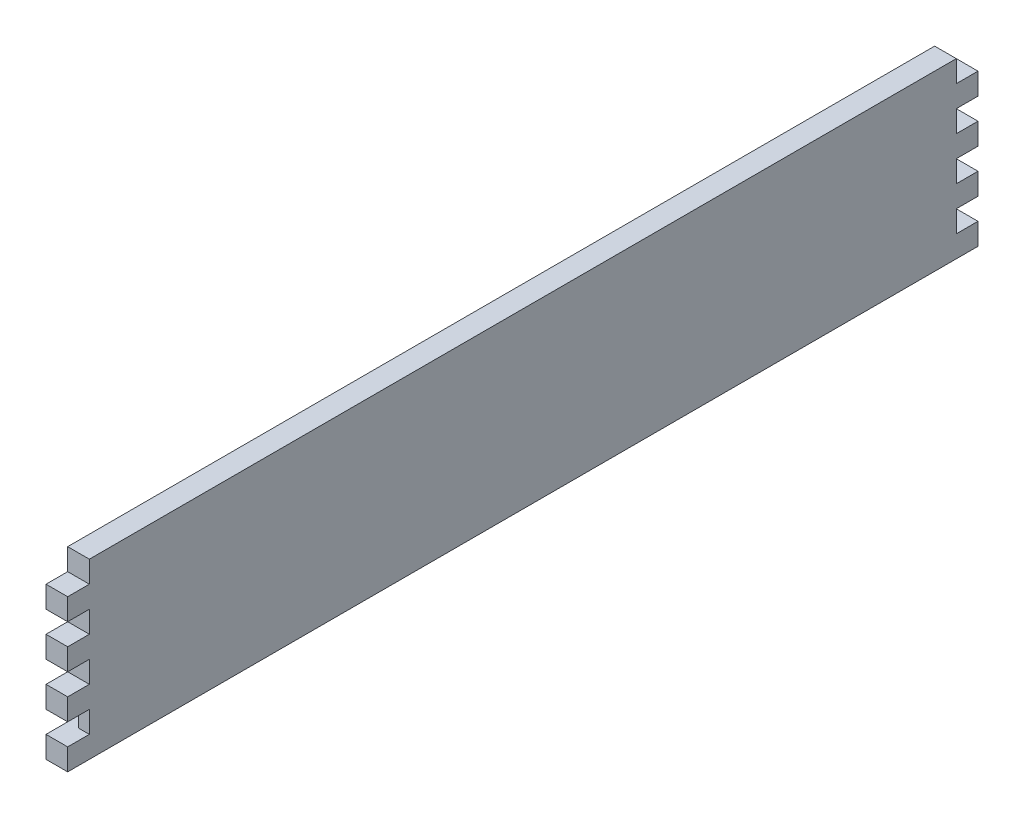
ISO-10303-21;
HEADER;
FILE_DESCRIPTION(('STEP AP214'),'2;1');
FILE_NAME('part.step','',(''),(''),'','','');
FILE_SCHEMA(('AUTOMOTIVE_DESIGN { 1 0 10303 214 1 1 1 1 }'));
ENDSEC;
DATA;
#1=APPLICATION_CONTEXT('core data for automotive mechanical design processes');
#2=APPLICATION_PROTOCOL_DEFINITION('international standard','automotive_design',2000,#1);
#3=PRODUCT_CONTEXT('',#1,'mechanical');
#4=PRODUCT('Part','Part','',(#3));
#5=PRODUCT_RELATED_PRODUCT_CATEGORY('part','',(#4));
#6=PRODUCT_DEFINITION_FORMATION('','',#4);
#7=PRODUCT_DEFINITION_CONTEXT('part definition',#1,'design');
#8=PRODUCT_DEFINITION('design','',#6,#7);
#9=PRODUCT_DEFINITION_SHAPE('','',#8);
#10=(LENGTH_UNIT() NAMED_UNIT(*) SI_UNIT(.MILLI.,.METRE.));
#11=(NAMED_UNIT(*) PLANE_ANGLE_UNIT() SI_UNIT($,.RADIAN.));
#12=(NAMED_UNIT(*) SI_UNIT($,.STERADIAN.) SOLID_ANGLE_UNIT());
#13=UNCERTAINTY_MEASURE_WITH_UNIT(LENGTH_MEASURE(1.E-05),#10,'distance_accuracy_value','');
#14=(GEOMETRIC_REPRESENTATION_CONTEXT(3) GLOBAL_UNCERTAINTY_ASSIGNED_CONTEXT((#13)) GLOBAL_UNIT_ASSIGNED_CONTEXT((#10,
#11,#12)) REPRESENTATION_CONTEXT('',''));
#15=CARTESIAN_POINT('',(0.,0.,0.));
#16=DIRECTION('',(0.,0.,1.));
#17=DIRECTION('',(1.,0.,0.));
#18=AXIS2_PLACEMENT_3D('',#15,#16,#17);
#19=CARTESIAN_POINT('',(12.7,1.33573707650224E-13,-12.7000000000009));
#20=DIRECTION('',(0.,0.,-1.));
#21=DIRECTION('',(0.,1.,0.));
#22=AXIS2_PLACEMENT_3D('',#19,#20,#21);
#23=PLANE('',#22);
#24=DIRECTION('',(-1.,0.,0.));
#25=VECTOR('',#24,1.);
#26=CARTESIAN_POINT('',(12.7,19.0499999999999,-12.7000000000007));
#27=LINE('',#26,#25);
#28=CARTESIAN_POINT('',(6.35,19.0499999999999,-12.7000000000007));
#29=VERTEX_POINT('',#28);
#30=CARTESIAN_POINT('',(0.,19.0499999999999,-12.7000000000007));
#31=VERTEX_POINT('',#30);
#32=EDGE_CURVE('E439',#29,#31,#27,.T.);
#33=ORIENTED_EDGE('',*,*,#32,.F.);
#34=DIRECTION('',(0.,1.,0.));
#35=VECTOR('',#34,1.);
#36=CARTESIAN_POINT('',(6.35,1.33573707650224E-13,-12.7000000000009));
#37=LINE('',#36,#35);
#38=CARTESIAN_POINT('',(6.35,12.6999999999999,-12.7000000000008));
#39=VERTEX_POINT('',#38);
#40=EDGE_CURVE('E279',#39,#29,#37,.T.);
#41=ORIENTED_EDGE('',*,*,#40,.F.);
#42=DIRECTION('',(-1.,0.,0.));
#43=VECTOR('',#42,1.);
#44=CARTESIAN_POINT('',(12.7,12.7,-12.7000000000008));
#45=LINE('',#44,#43);
#46=CARTESIAN_POINT('',(12.7,12.7,-12.7000000000008));
#47=VERTEX_POINT('',#46);
#48=EDGE_CURVE('E368',#47,#39,#45,.T.);
#49=ORIENTED_EDGE('',*,*,#48,.F.);
#50=DIRECTION('',(0.,-1.,0.));
#51=VECTOR('',#50,1.);
#52=CARTESIAN_POINT('',(12.7,1.33573707650224E-13,-12.7000000000009));
#53=LINE('',#52,#51);
#54=CARTESIAN_POINT('',(12.7,25.4,-12.7000000000007));
#55=VERTEX_POINT('',#54);
#56=EDGE_CURVE('E520',#55,#47,#53,.T.);
#57=ORIENTED_EDGE('',*,*,#56,.F.);
#58=DIRECTION('',(-1.,0.,0.));
#59=VECTOR('',#58,1.);
#60=CARTESIAN_POINT('',(12.7,25.4,-12.7000000000007));
#61=LINE('',#60,#59);
#62=CARTESIAN_POINT('',(0.,25.4,-12.7000000000007));
#63=VERTEX_POINT('',#62);
#64=EDGE_CURVE('E371',#55,#63,#61,.T.);
#65=ORIENTED_EDGE('',*,*,#64,.T.);
#66=DIRECTION('',(0.,-1.,0.));
#67=VECTOR('',#66,1.);
#68=CARTESIAN_POINT('',(0.,1.33573707650224E-13,-12.7000000000009));
#69=LINE('',#68,#67);
#70=EDGE_CURVE('E346',#63,#31,#69,.T.);
#71=ORIENTED_EDGE('',*,*,#70,.T.);
#72=EDGE_LOOP('',(#33,#41,#49,#57,#65,#71));
#73=FACE_BOUND('',#72,.T.);
#74=ADVANCED_FACE('F33',(#73),#23,.F.);
#75=CARTESIAN_POINT('',(12.7,4.55191440096315E-12,-520.700000000001));
#76=DIRECTION('',(0.,0.,-1.));
#77=DIRECTION('',(0.,1.,0.));
#78=AXIS2_PLACEMENT_3D('',#75,#76,#77);
#79=PLANE('',#78);
#80=DIRECTION('',(0.,1.,0.));
#81=VECTOR('',#80,1.);
#82=CARTESIAN_POINT('',(6.35,4.55191440096315E-12,-520.700000000001));
#83=LINE('',#82,#81);
#84=CARTESIAN_POINT('',(6.35,12.7,-520.700000000001));
#85=VERTEX_POINT('',#84);
#86=CARTESIAN_POINT('',(6.35,19.05,-520.700000000001));
#87=VERTEX_POINT('',#86);
#88=EDGE_CURVE('E11',#85,#87,#83,.T.);
#89=ORIENTED_EDGE('',*,*,#88,.T.);
#90=DIRECTION('',(-1.,0.,0.));
#91=VECTOR('',#90,1.);
#92=CARTESIAN_POINT('',(12.7,19.05,-520.700000000001));
#93=LINE('',#92,#91);
#94=CARTESIAN_POINT('',(0.,19.05,-520.700000000001));
#95=VERTEX_POINT('',#94);
#96=EDGE_CURVE('E435',#87,#95,#93,.T.);
#97=ORIENTED_EDGE('',*,*,#96,.T.);
#98=DIRECTION('',(0.,-1.,0.));
#99=VECTOR('',#98,1.);
#100=CARTESIAN_POINT('',(0.,4.55191440096315E-12,-520.700000000001));
#101=LINE('',#100,#99);
#102=CARTESIAN_POINT('',(0.,25.4,-520.700000000001));
#103=VERTEX_POINT('',#102);
#104=EDGE_CURVE('E357',#103,#95,#101,.T.);
#105=ORIENTED_EDGE('',*,*,#104,.F.);
#106=DIRECTION('',(-1.,0.,0.));
#107=VECTOR('',#106,1.);
#108=CARTESIAN_POINT('',(12.7,25.4,-520.700000000001));
#109=LINE('',#108,#107);
#110=CARTESIAN_POINT('',(12.7,25.4,-520.700000000001));
#111=VERTEX_POINT('',#110);
#112=EDGE_CURVE('E50',#111,#103,#109,.T.);
#113=ORIENTED_EDGE('',*,*,#112,.F.);
#114=DIRECTION('',(0.,-1.,0.));
#115=VECTOR('',#114,1.);
#116=CARTESIAN_POINT('',(12.7,4.55191440096315E-12,-520.700000000001));
#117=LINE('',#116,#115);
#118=CARTESIAN_POINT('',(12.7,12.7,-520.700000000001));
#119=VERTEX_POINT('',#118);
#120=EDGE_CURVE('E271',#111,#119,#117,.T.);
#121=ORIENTED_EDGE('',*,*,#120,.T.);
#122=DIRECTION('',(-1.,0.,0.));
#123=VECTOR('',#122,1.);
#124=CARTESIAN_POINT('',(12.7,12.7,-520.700000000001));
#125=LINE('',#124,#123);
#126=EDGE_CURVE('E266',#119,#85,#125,.T.);
#127=ORIENTED_EDGE('',*,*,#126,.T.);
#128=EDGE_LOOP('',(#89,#97,#105,#113,#121,#127));
#129=FACE_BOUND('',#128,.T.);
#130=ADVANCED_FACE('F444',(#129),#79,.T.);
#131=CARTESIAN_POINT('',(0.,0.,0.));
#132=DIRECTION('',(1.,0.,0.));
#133=DIRECTION('',(0.,0.,-1.));
#134=AXIS2_PLACEMENT_3D('',#131,#132,#133);
#135=PLANE('',#134);
#136=DIRECTION('',(0.,0.,-1.));
#137=VECTOR('',#136,1.);
#138=CARTESIAN_POINT('',(0.,19.0499999999999,0.));
#139=LINE('',#138,#137);
#140=EDGE_CURVE('E42',#31,#95,#139,.T.);
#141=ORIENTED_EDGE('',*,*,#140,.F.);
#142=ORIENTED_EDGE('',*,*,#70,.F.);
#143=DIRECTION('',(0.,0.,1.));
#144=VECTOR('',#143,1.);
#145=CARTESIAN_POINT('',(0.,25.4,0.));
#146=LINE('',#145,#144);
#147=CARTESIAN_POINT('',(0.,25.4,-6.65127195526621E-13));
#148=VERTEX_POINT('',#147);
#149=EDGE_CURVE('E343',#63,#148,#146,.T.);
#150=ORIENTED_EDGE('',*,*,#149,.T.);
#151=DIRECTION('',(0.,1.,0.));
#152=VECTOR('',#151,1.);
#153=CARTESIAN_POINT('',(0.,0.,-9.31178073069464E-13));
#154=LINE('',#153,#152);
#155=CARTESIAN_POINT('',(0.,38.1,-5.32101756421297E-13));
#156=VERTEX_POINT('',#155);
#157=EDGE_CURVE('E340',#148,#156,#154,.T.);
#158=ORIENTED_EDGE('',*,*,#157,.T.);
#159=DIRECTION('',(0.,0.,1.));
#160=VECTOR('',#159,1.);
#161=CARTESIAN_POINT('',(0.,38.1,0.));
#162=LINE('',#161,#160);
#163=CARTESIAN_POINT('',(0.,38.1,-12.7000000000005));
#164=VERTEX_POINT('',#163);
#165=EDGE_CURVE('E337',#164,#156,#162,.T.);
#166=ORIENTED_EDGE('',*,*,#165,.F.);
#167=DIRECTION('',(0.,-1.,0.));
#168=VECTOR('',#167,1.);
#169=CARTESIAN_POINT('',(0.,1.33573707650224E-13,-12.7000000000009));
#170=LINE('',#169,#168);
#171=CARTESIAN_POINT('',(0.,50.8,-12.7000000000004));
#172=VERTEX_POINT('',#171);
#173=EDGE_CURVE('E335',#172,#164,#170,.T.);
#174=ORIENTED_EDGE('',*,*,#173,.F.);
#175=DIRECTION('',(0.,0.,1.));
#176=VECTOR('',#175,1.);
#177=CARTESIAN_POINT('',(0.,50.8,0.));
#178=LINE('',#177,#176);
#179=CARTESIAN_POINT('',(0.,50.8,-3.99076317315973E-13));
#180=VERTEX_POINT('',#179);
#181=EDGE_CURVE('E332',#172,#180,#178,.T.);
#182=ORIENTED_EDGE('',*,*,#181,.T.);
#183=DIRECTION('',(0.,1.,0.));
#184=VECTOR('',#183,1.);
#185=CARTESIAN_POINT('',(0.,0.,-9.31178073069463E-13));
#186=LINE('',#185,#184);
#187=CARTESIAN_POINT('',(0.,63.5,-2.66050878210648E-13));
#188=VERTEX_POINT('',#187);
#189=EDGE_CURVE('E329',#180,#188,#186,.T.);
#190=ORIENTED_EDGE('',*,*,#189,.T.);
#191=DIRECTION('',(0.,0.,1.));
#192=VECTOR('',#191,1.);
#193=CARTESIAN_POINT('',(0.,63.5,0.));
#194=LINE('',#193,#192);
#195=CARTESIAN_POINT('',(0.,63.5,-12.7000000000003));
#196=VERTEX_POINT('',#195);
#197=EDGE_CURVE('E326',#196,#188,#194,.T.);
#198=ORIENTED_EDGE('',*,*,#197,.F.);
#199=DIRECTION('',(0.,-1.,0.));
#200=VECTOR('',#199,1.);
#201=CARTESIAN_POINT('',(0.,1.31838984174247E-13,-12.7000000000009));
#202=LINE('',#201,#200);
#203=CARTESIAN_POINT('',(0.,76.2,-12.7000000000001));
#204=VERTEX_POINT('',#203);
#205=EDGE_CURVE('E324',#204,#196,#202,.T.);
#206=ORIENTED_EDGE('',*,*,#205,.F.);
#207=DIRECTION('',(0.,0.,1.));
#208=VECTOR('',#207,1.);
#209=CARTESIAN_POINT('',(0.,76.2,0.));
#210=LINE('',#209,#208);
#211=CARTESIAN_POINT('',(0.,76.2,-1.33025439105324E-13));
#212=VERTEX_POINT('',#211);
#213=EDGE_CURVE('E321',#204,#212,#210,.T.);
#214=ORIENTED_EDGE('',*,*,#213,.T.);
#215=DIRECTION('',(0.,1.,0.));
#216=VECTOR('',#215,1.);
#217=CARTESIAN_POINT('',(0.,0.,-9.31178073069463E-13));
#218=LINE('',#217,#216);
#219=CARTESIAN_POINT('',(0.,88.9,0.));
#220=VERTEX_POINT('',#219);
#221=EDGE_CURVE('E318',#212,#220,#218,.T.);
#222=ORIENTED_EDGE('',*,*,#221,.T.);
#223=DIRECTION('',(0.,0.,1.));
#224=VECTOR('',#223,1.);
#225=CARTESIAN_POINT('',(0.,88.9,0.));
#226=LINE('',#225,#224);
#227=CARTESIAN_POINT('',(0.,88.9,-12.7));
#228=VERTEX_POINT('',#227);
#229=EDGE_CURVE('E315',#228,#220,#226,.T.);
#230=ORIENTED_EDGE('',*,*,#229,.F.);
#231=DIRECTION('',(0.,-1.,0.));
#232=VECTOR('',#231,1.);
#233=CARTESIAN_POINT('',(0.,0.,-12.7));
#234=LINE('',#233,#232);
#235=CARTESIAN_POINT('',(0.,101.6,-12.7));
#236=VERTEX_POINT('',#235);
#237=EDGE_CURVE('E313',#236,#228,#234,.T.);
#238=ORIENTED_EDGE('',*,*,#237,.F.);
#239=DIRECTION('',(0.,0.,-1.));
#240=VECTOR('',#239,1.);
#241=CARTESIAN_POINT('',(0.,101.6,0.));
#242=LINE('',#241,#240);
#243=CARTESIAN_POINT('',(0.,101.6,-520.7));
#244=VERTEX_POINT('',#243);
#245=EDGE_CURVE('E310',#236,#244,#242,.T.);
#246=ORIENTED_EDGE('',*,*,#245,.T.);
#247=DIRECTION('',(0.,-1.,0.));
#248=VECTOR('',#247,1.);
#249=CARTESIAN_POINT('',(0.,0.,-520.7));
#250=LINE('',#249,#248);
#251=CARTESIAN_POINT('',(0.,88.9,-520.7));
#252=VERTEX_POINT('',#251);
#253=EDGE_CURVE('E307',#244,#252,#250,.T.);
#254=ORIENTED_EDGE('',*,*,#253,.T.);
#255=DIRECTION('',(0.,0.,-1.));
#256=VECTOR('',#255,1.);
#257=CARTESIAN_POINT('',(0.,88.9,0.));
#258=LINE('',#257,#256);
#259=CARTESIAN_POINT('',(0.,88.9,-533.4));
#260=VERTEX_POINT('',#259);
#261=EDGE_CURVE('E304',#252,#260,#258,.T.);
#262=ORIENTED_EDGE('',*,*,#261,.T.);
#263=DIRECTION('',(0.,1.,0.));
#264=VECTOR('',#263,1.);
#265=CARTESIAN_POINT('',(0.,4.66293670342566E-12,-533.400000000001));
#266=LINE('',#265,#264);
#267=CARTESIAN_POINT('',(0.,76.2,-533.4));
#268=VERTEX_POINT('',#267);
#269=EDGE_CURVE('E301',#268,#260,#266,.T.);
#270=ORIENTED_EDGE('',*,*,#269,.F.);
#271=DIRECTION('',(0.,0.,-1.));
#272=VECTOR('',#271,1.);
#273=CARTESIAN_POINT('',(0.,76.2,0.));
#274=LINE('',#273,#272);
#275=CARTESIAN_POINT('',(0.,76.2,-520.7));
#276=VERTEX_POINT('',#275);
#277=EDGE_CURVE('E299',#276,#268,#274,.T.);
#278=ORIENTED_EDGE('',*,*,#277,.F.);
#279=DIRECTION('',(0.,-1.,0.));
#280=VECTOR('',#279,1.);
#281=CARTESIAN_POINT('',(0.,4.55191440096315E-12,-520.700000000001));
#282=LINE('',#281,#280);
#283=CARTESIAN_POINT('',(0.,63.5,-520.7));
#284=VERTEX_POINT('',#283);
#285=EDGE_CURVE('E296',#276,#284,#282,.T.);
#286=ORIENTED_EDGE('',*,*,#285,.T.);
#287=DIRECTION('',(0.,0.,-1.));
#288=VECTOR('',#287,1.);
#289=CARTESIAN_POINT('',(0.,63.5,0.));
#290=LINE('',#289,#288);
#291=CARTESIAN_POINT('',(0.,63.5,-533.4));
#292=VERTEX_POINT('',#291);
#293=EDGE_CURVE('E293',#284,#292,#290,.T.);
#294=ORIENTED_EDGE('',*,*,#293,.T.);
#295=DIRECTION('',(0.,1.,0.));
#296=VECTOR('',#295,1.);
#297=CARTESIAN_POINT('',(0.,9.32587340685134E-12,-533.400000000001));
#298=LINE('',#297,#296);
#299=CARTESIAN_POINT('',(0.,50.8,-533.4));
#300=VERTEX_POINT('',#299);
#301=EDGE_CURVE('E290',#300,#292,#298,.T.);
#302=ORIENTED_EDGE('',*,*,#301,.F.);
#303=DIRECTION('',(0.,0.,-1.));
#304=VECTOR('',#303,1.);
#305=CARTESIAN_POINT('',(0.,50.8,0.));
#306=LINE('',#305,#304);
#307=CARTESIAN_POINT('',(0.,50.8,-520.7));
#308=VERTEX_POINT('',#307);
#309=EDGE_CURVE('E288',#308,#300,#306,.T.);
#310=ORIENTED_EDGE('',*,*,#309,.F.);
#311=DIRECTION('',(0.,-1.,0.));
#312=VECTOR('',#311,1.);
#313=CARTESIAN_POINT('',(0.,4.55191440096315E-12,-520.700000000001));
#314=LINE('',#313,#312);
#315=CARTESIAN_POINT('',(0.,38.1,-520.700000000001));
#316=VERTEX_POINT('',#315);
#317=EDGE_CURVE('E285',#308,#316,#314,.T.);
#318=ORIENTED_EDGE('',*,*,#317,.T.);
#319=DIRECTION('',(0.,0.,-1.));
#320=VECTOR('',#319,1.);
#321=CARTESIAN_POINT('',(0.,38.1,0.));
#322=LINE('',#321,#320);
#323=CARTESIAN_POINT('',(0.,38.1,-533.400000000001));
#324=VERTEX_POINT('',#323);
#325=EDGE_CURVE('E282',#316,#324,#322,.T.);
#326=ORIENTED_EDGE('',*,*,#325,.T.);
#327=DIRECTION('',(0.,1.,0.));
#328=VECTOR('',#327,1.);
#329=CARTESIAN_POINT('',(0.,4.66293670342566E-12,-533.400000000001));
#330=LINE('',#329,#328);
#331=CARTESIAN_POINT('',(0.,25.4,-533.400000000001));
#332=VERTEX_POINT('',#331);
#333=EDGE_CURVE('E278',#332,#324,#330,.T.);
#334=ORIENTED_EDGE('',*,*,#333,.F.);
#335=DIRECTION('',(0.,0.,-1.));
#336=VECTOR('',#335,1.);
#337=CARTESIAN_POINT('',(0.,25.4,0.));
#338=LINE('',#337,#336);
#339=EDGE_CURVE('E276',#103,#332,#338,.T.);
#340=ORIENTED_EDGE('',*,*,#339,.F.);
#341=ORIENTED_EDGE('',*,*,#104,.T.);
#342=EDGE_LOOP('',(#141,#142,#150,#158,#166,#174,#182,#190,#198,#206,#214,#222,#230,#238,#246,
#254,#262,#270,#278,#286,#294,#302,#310,#318,#326,#334,#340,#341));
#343=FACE_BOUND('',#342,.T.);
#344=ADVANCED_FACE('F448',(#343),#135,.F.);
#345=DIRECTION('',(0.,1.,0.));
#346=VECTOR('',#345,1.);
#347=CARTESIAN_POINT('',(0.,0.,0.));
#348=LINE('',#347,#346);
#349=CARTESIAN_POINT('',(0.,0.,0.));
#350=VERTEX_POINT('',#349);
#351=CARTESIAN_POINT('',(0.,12.7,-7.9815263405954E-13));
#352=VERTEX_POINT('',#351);
#353=EDGE_CURVE('E349',#350,#352,#348,.T.);
#354=ORIENTED_EDGE('',*,*,#353,.T.);
#355=DIRECTION('',(0.,0.,-1.));
#356=VECTOR('',#355,1.);
#357=CARTESIAN_POINT('',(0.,12.7,0.));
#358=LINE('',#357,#356);
#359=CARTESIAN_POINT('',(0.,12.7,-533.400000000001));
#360=VERTEX_POINT('',#359);
#361=EDGE_CURVE('E355',#352,#360,#358,.T.);
#362=ORIENTED_EDGE('',*,*,#361,.T.);
#363=DIRECTION('',(0.,1.,0.));
#364=VECTOR('',#363,1.);
#365=CARTESIAN_POINT('',(0.,-3.26405569239796E-11,-533.4));
#366=LINE('',#365,#364);
#367=CARTESIAN_POINT('',(0.,0.,-533.4));
#368=VERTEX_POINT('',#367);
#369=EDGE_CURVE('E263',#368,#360,#366,.T.);
#370=ORIENTED_EDGE('',*,*,#369,.F.);
#371=DIRECTION('',(0.,0.,-1.));
#372=VECTOR('',#371,1.);
#373=CARTESIAN_POINT('',(0.,0.,0.));
#374=LINE('',#373,#372);
#375=EDGE_CURVE('E352',#350,#368,#374,.T.);
#376=ORIENTED_EDGE('',*,*,#375,.F.);
#377=EDGE_LOOP('',(#354,#362,#370,#376));
#378=FACE_BOUND('',#377,.T.);
#379=ADVANCED_FACE('F536',(#378),#135,.F.);
#380=CARTESIAN_POINT('',(12.7,25.4,0.));
#381=DIRECTION('',(0.,1.,0.));
#382=DIRECTION('',(0.,0.,1.));
#383=AXIS2_PLACEMENT_3D('',#380,#381,#382);
#384=PLANE('',#383);
#385=ORIENTED_EDGE('',*,*,#339,.T.);
#386=DIRECTION('',(-1.,0.,0.));
#387=VECTOR('',#386,1.);
#388=CARTESIAN_POINT('',(12.7,25.4,-533.400000000001));
#389=LINE('',#388,#387);
#390=CARTESIAN_POINT('',(12.7,25.4,-533.400000000001));
#391=VERTEX_POINT('',#390);
#392=EDGE_CURVE('E424',#391,#332,#389,.T.);
#393=ORIENTED_EDGE('',*,*,#392,.F.);
#394=DIRECTION('',(0.,0.,-1.));
#395=VECTOR('',#394,1.);
#396=CARTESIAN_POINT('',(12.7,25.4,0.));
#397=LINE('',#396,#395);
#398=EDGE_CURVE('E360',#111,#391,#397,.T.);
#399=ORIENTED_EDGE('',*,*,#398,.F.);
#400=ORIENTED_EDGE('',*,*,#112,.T.);
#401=EDGE_LOOP('',(#385,#393,#399,#400));
#402=FACE_BOUND('',#401,.T.);
#403=ADVANCED_FACE('F35',(#402),#384,.F.);
#404=CARTESIAN_POINT('',(12.7,4.66293670342566E-12,-533.400000000001));
#405=DIRECTION('',(0.,0.,1.));
#406=DIRECTION('',(0.,-1.,0.));
#407=AXIS2_PLACEMENT_3D('',#404,#405,#406);
#408=PLANE('',#407);
#409=ORIENTED_EDGE('',*,*,#333,.T.);
#410=DIRECTION('',(-1.,0.,0.));
#411=VECTOR('',#410,1.);
#412=CARTESIAN_POINT('',(12.7,38.1,-533.400000000001));
#413=LINE('',#412,#411);
#414=CARTESIAN_POINT('',(12.7,38.1,-533.400000000001));
#415=VERTEX_POINT('',#414);
#416=EDGE_CURVE('E422',#415,#324,#413,.T.);
#417=ORIENTED_EDGE('',*,*,#416,.F.);
#418=DIRECTION('',(0.,1.,0.));
#419=VECTOR('',#418,1.);
#420=CARTESIAN_POINT('',(12.7,4.66293670342566E-12,-533.400000000001));
#421=LINE('',#420,#419);
#422=EDGE_CURVE('E160',#391,#415,#421,.T.);
#423=ORIENTED_EDGE('',*,*,#422,.F.);
#424=ORIENTED_EDGE('',*,*,#392,.T.);
#425=EDGE_LOOP('',(#409,#417,#423,#424));
#426=FACE_BOUND('',#425,.T.);
#427=ADVANCED_FACE('F450',(#426),#408,.F.);
#428=CARTESIAN_POINT('',(12.7,38.1,0.));
#429=DIRECTION('',(0.,1.,0.));
#430=DIRECTION('',(0.,0.,1.));
#431=AXIS2_PLACEMENT_3D('',#428,#429,#430);
#432=PLANE('',#431);
#433=ORIENTED_EDGE('',*,*,#325,.F.);
#434=DIRECTION('',(-1.,0.,0.));
#435=VECTOR('',#434,1.);
#436=CARTESIAN_POINT('',(12.7,38.1,-520.700000000001));
#437=LINE('',#436,#435);
#438=CARTESIAN_POINT('',(12.7,38.1,-520.700000000001));
#439=VERTEX_POINT('',#438);
#440=EDGE_CURVE('E420',#439,#316,#437,.T.);
#441=ORIENTED_EDGE('',*,*,#440,.F.);
#442=DIRECTION('',(0.,0.,-1.));
#443=VECTOR('',#442,1.);
#444=CARTESIAN_POINT('',(12.7,38.1,0.));
#445=LINE('',#444,#443);
#446=EDGE_CURVE('E458',#439,#415,#445,.T.);
#447=ORIENTED_EDGE('',*,*,#446,.T.);
#448=ORIENTED_EDGE('',*,*,#416,.T.);
#449=EDGE_LOOP('',(#433,#441,#447,#448));
#450=FACE_BOUND('',#449,.T.);
#451=ADVANCED_FACE('F456',(#450),#432,.T.);
#452=CARTESIAN_POINT('',(12.7,4.55191440096315E-12,-520.700000000001));
#453=DIRECTION('',(0.,0.,-1.));
#454=DIRECTION('',(0.,1.,0.));
#455=AXIS2_PLACEMENT_3D('',#452,#453,#454);
#456=PLANE('',#455);
#457=ORIENTED_EDGE('',*,*,#317,.F.);
#458=DIRECTION('',(-1.,0.,0.));
#459=VECTOR('',#458,1.);
#460=CARTESIAN_POINT('',(12.7,50.8,-520.7));
#461=LINE('',#460,#459);
#462=CARTESIAN_POINT('',(12.7,50.8,-520.7));
#463=VERTEX_POINT('',#462);
#464=EDGE_CURVE('E418',#463,#308,#461,.T.);
#465=ORIENTED_EDGE('',*,*,#464,.F.);
#466=DIRECTION('',(0.,-1.,0.));
#467=VECTOR('',#466,1.);
#468=CARTESIAN_POINT('',(12.7,4.55191440096315E-12,-520.700000000001));
#469=LINE('',#468,#467);
#470=EDGE_CURVE('E461',#463,#439,#469,.T.);
#471=ORIENTED_EDGE('',*,*,#470,.T.);
#472=ORIENTED_EDGE('',*,*,#440,.T.);
#473=EDGE_LOOP('',(#457,#465,#471,#472));
#474=FACE_BOUND('',#473,.T.);
#475=ADVANCED_FACE('F641',(#474),#456,.T.);
#476=CARTESIAN_POINT('',(12.7,50.8,0.));
#477=DIRECTION('',(0.,1.,0.));
#478=DIRECTION('',(0.,0.,1.));
#479=AXIS2_PLACEMENT_3D('',#476,#477,#478);
#480=PLANE('',#479);
#481=ORIENTED_EDGE('',*,*,#309,.T.);
#482=DIRECTION('',(-1.,0.,0.));
#483=VECTOR('',#482,1.);
#484=CARTESIAN_POINT('',(12.7,50.8,-533.4));
#485=LINE('',#484,#483);
#486=CARTESIAN_POINT('',(12.7,50.8,-533.4));
#487=VERTEX_POINT('',#486);
#488=EDGE_CURVE('E415',#487,#300,#485,.T.);
#489=ORIENTED_EDGE('',*,*,#488,.F.);
#490=DIRECTION('',(0.,0.,-1.));
#491=VECTOR('',#490,1.);
#492=CARTESIAN_POINT('',(12.7,50.8,0.));
#493=LINE('',#492,#491);
#494=EDGE_CURVE('E463',#463,#487,#493,.T.);
#495=ORIENTED_EDGE('',*,*,#494,.F.);
#496=ORIENTED_EDGE('',*,*,#464,.T.);
#497=EDGE_LOOP('',(#481,#489,#495,#496));
#498=FACE_BOUND('',#497,.T.);
#499=ADVANCED_FACE('F637',(#498),#480,.F.);
#500=CARTESIAN_POINT('',(12.7,9.32587340685134E-12,-533.400000000001));
#501=DIRECTION('',(0.,0.,1.));
#502=DIRECTION('',(0.,-1.,0.));
#503=AXIS2_PLACEMENT_3D('',#500,#501,#502);
#504=PLANE('',#503);
#505=ORIENTED_EDGE('',*,*,#301,.T.);
#506=DIRECTION('',(-1.,0.,0.));
#507=VECTOR('',#506,1.);
#508=CARTESIAN_POINT('',(12.7,63.5,-533.4));
#509=LINE('',#508,#507);
#510=CARTESIAN_POINT('',(12.7,63.5,-533.4));
#511=VERTEX_POINT('',#510);
#512=EDGE_CURVE('E413',#511,#292,#509,.T.);
#513=ORIENTED_EDGE('',*,*,#512,.F.);
#514=DIRECTION('',(0.,1.,0.));
#515=VECTOR('',#514,1.);
#516=CARTESIAN_POINT('',(12.7,9.32587340685134E-12,-533.400000000001));
#517=LINE('',#516,#515);
#518=EDGE_CURVE('E469',#487,#511,#517,.T.);
#519=ORIENTED_EDGE('',*,*,#518,.F.);
#520=ORIENTED_EDGE('',*,*,#488,.T.);
#521=EDGE_LOOP('',(#505,#513,#519,#520));
#522=FACE_BOUND('',#521,.T.);
#523=ADVANCED_FACE('F633',(#522),#504,.F.);
#524=CARTESIAN_POINT('',(12.7,63.5,0.));
#525=DIRECTION('',(0.,1.,0.));
#526=DIRECTION('',(0.,0.,1.));
#527=AXIS2_PLACEMENT_3D('',#524,#525,#526);
#528=PLANE('',#527);
#529=ORIENTED_EDGE('',*,*,#293,.F.);
#530=DIRECTION('',(-1.,0.,0.));
#531=VECTOR('',#530,1.);
#532=CARTESIAN_POINT('',(12.7,63.5,-520.7));
#533=LINE('',#532,#531);
#534=CARTESIAN_POINT('',(12.7,63.5,-520.7));
#535=VERTEX_POINT('',#534);
#536=EDGE_CURVE('E411',#535,#284,#533,.T.);
#537=ORIENTED_EDGE('',*,*,#536,.F.);
#538=DIRECTION('',(0.,0.,-1.));
#539=VECTOR('',#538,1.);
#540=CARTESIAN_POINT('',(12.7,63.5,0.));
#541=LINE('',#540,#539);
#542=EDGE_CURVE('E471',#535,#511,#541,.T.);
#543=ORIENTED_EDGE('',*,*,#542,.T.);
#544=ORIENTED_EDGE('',*,*,#512,.T.);
#545=EDGE_LOOP('',(#529,#537,#543,#544));
#546=FACE_BOUND('',#545,.T.);
#547=ADVANCED_FACE('F629',(#546),#528,.T.);
#548=CARTESIAN_POINT('',(12.7,4.55191440096315E-12,-520.700000000001));
#549=DIRECTION('',(0.,0.,-1.));
#550=DIRECTION('',(0.,1.,0.));
#551=AXIS2_PLACEMENT_3D('',#548,#549,#550);
#552=PLANE('',#551);
#553=ORIENTED_EDGE('',*,*,#285,.F.);
#554=DIRECTION('',(-1.,0.,0.));
#555=VECTOR('',#554,1.);
#556=CARTESIAN_POINT('',(12.7,76.2,-520.7));
#557=LINE('',#556,#555);
#558=CARTESIAN_POINT('',(12.7,76.2,-520.7));
#559=VERTEX_POINT('',#558);
#560=EDGE_CURVE('E409',#559,#276,#557,.T.);
#561=ORIENTED_EDGE('',*,*,#560,.F.);
#562=DIRECTION('',(0.,-1.,0.));
#563=VECTOR('',#562,1.);
#564=CARTESIAN_POINT('',(12.7,4.55191440096315E-12,-520.700000000001));
#565=LINE('',#564,#563);
#566=EDGE_CURVE('E474',#559,#535,#565,.T.);
#567=ORIENTED_EDGE('',*,*,#566,.T.);
#568=ORIENTED_EDGE('',*,*,#536,.T.);
#569=EDGE_LOOP('',(#553,#561,#567,#568));
#570=FACE_BOUND('',#569,.T.);
#571=ADVANCED_FACE('F625',(#570),#552,.T.);
#572=CARTESIAN_POINT('',(12.7,76.2,0.));
#573=DIRECTION('',(0.,1.,0.));
#574=DIRECTION('',(0.,0.,1.));
#575=AXIS2_PLACEMENT_3D('',#572,#573,#574);
#576=PLANE('',#575);
#577=ORIENTED_EDGE('',*,*,#277,.T.);
#578=DIRECTION('',(-1.,0.,0.));
#579=VECTOR('',#578,1.);
#580=CARTESIAN_POINT('',(12.7,76.2,-533.4));
#581=LINE('',#580,#579);
#582=CARTESIAN_POINT('',(12.7,76.2,-533.4));
#583=VERTEX_POINT('',#582);
#584=EDGE_CURVE('E406',#583,#268,#581,.T.);
#585=ORIENTED_EDGE('',*,*,#584,.F.);
#586=DIRECTION('',(0.,0.,-1.));
#587=VECTOR('',#586,1.);
#588=CARTESIAN_POINT('',(12.7,76.2,0.));
#589=LINE('',#588,#587);
#590=EDGE_CURVE('E477',#559,#583,#589,.T.);
#591=ORIENTED_EDGE('',*,*,#590,.F.);
#592=ORIENTED_EDGE('',*,*,#560,.T.);
#593=EDGE_LOOP('',(#577,#585,#591,#592));
#594=FACE_BOUND('',#593,.T.);
#595=ADVANCED_FACE('F621',(#594),#576,.F.);
#596=CARTESIAN_POINT('',(12.7,4.66293670342566E-12,-533.400000000001));
#597=DIRECTION('',(0.,0.,1.));
#598=DIRECTION('',(0.,-1.,0.));
#599=AXIS2_PLACEMENT_3D('',#596,#597,#598);
#600=PLANE('',#599);
#601=ORIENTED_EDGE('',*,*,#269,.T.);
#602=DIRECTION('',(-1.,0.,0.));
#603=VECTOR('',#602,1.);
#604=CARTESIAN_POINT('',(12.7,88.9,-533.4));
#605=LINE('',#604,#603);
#606=CARTESIAN_POINT('',(12.7,88.9,-533.4));
#607=VERTEX_POINT('',#606);
#608=EDGE_CURVE('E404',#607,#260,#605,.T.);
#609=ORIENTED_EDGE('',*,*,#608,.F.);
#610=DIRECTION('',(0.,1.,0.));
#611=VECTOR('',#610,1.);
#612=CARTESIAN_POINT('',(12.7,4.66293670342566E-12,-533.400000000001));
#613=LINE('',#612,#611);
#614=EDGE_CURVE('E479',#583,#607,#613,.T.);
#615=ORIENTED_EDGE('',*,*,#614,.F.);
#616=ORIENTED_EDGE('',*,*,#584,.T.);
#617=EDGE_LOOP('',(#601,#609,#615,#616));
#618=FACE_BOUND('',#617,.T.);
#619=ADVANCED_FACE('F617',(#618),#600,.F.);
#620=CARTESIAN_POINT('',(12.7,88.9,0.));
#621=DIRECTION('',(0.,1.,0.));
#622=DIRECTION('',(0.,0.,1.));
#623=AXIS2_PLACEMENT_3D('',#620,#621,#622);
#624=PLANE('',#623);
#625=ORIENTED_EDGE('',*,*,#261,.F.);
#626=DIRECTION('',(-1.,0.,0.));
#627=VECTOR('',#626,1.);
#628=CARTESIAN_POINT('',(12.7,88.9,-520.7));
#629=LINE('',#628,#627);
#630=CARTESIAN_POINT('',(12.7,88.9,-520.7));
#631=VERTEX_POINT('',#630);
#632=EDGE_CURVE('E402',#631,#252,#629,.T.);
#633=ORIENTED_EDGE('',*,*,#632,.F.);
#634=DIRECTION('',(0.,0.,-1.));
#635=VECTOR('',#634,1.);
#636=CARTESIAN_POINT('',(12.7,88.9,0.));
#637=LINE('',#636,#635);
#638=EDGE_CURVE('E481',#631,#607,#637,.T.);
#639=ORIENTED_EDGE('',*,*,#638,.T.);
#640=ORIENTED_EDGE('',*,*,#608,.T.);
#641=EDGE_LOOP('',(#625,#633,#639,#640));
#642=FACE_BOUND('',#641,.T.);
#643=ADVANCED_FACE('F613',(#642),#624,.T.);
#644=CARTESIAN_POINT('',(12.7,0.,-520.7));
#645=DIRECTION('',(0.,0.,-1.));
#646=DIRECTION('',(-1.,0.,0.));
#647=AXIS2_PLACEMENT_3D('',#644,#645,#646);
#648=PLANE('',#647);
#649=ORIENTED_EDGE('',*,*,#253,.F.);
#650=DIRECTION('',(-1.,0.,0.));
#651=VECTOR('',#650,1.);
#652=CARTESIAN_POINT('',(12.7,101.6,-520.7));
#653=LINE('',#652,#651);
#654=CARTESIAN_POINT('',(12.7,101.6,-520.7));
#655=VERTEX_POINT('',#654);
#656=EDGE_CURVE('E400',#655,#244,#653,.T.);
#657=ORIENTED_EDGE('',*,*,#656,.F.);
#658=DIRECTION('',(0.,-1.,0.));
#659=VECTOR('',#658,1.);
#660=CARTESIAN_POINT('',(12.7,0.,-520.7));
#661=LINE('',#660,#659);
#662=EDGE_CURVE('E484',#655,#631,#661,.T.);
#663=ORIENTED_EDGE('',*,*,#662,.T.);
#664=ORIENTED_EDGE('',*,*,#632,.T.);
#665=EDGE_LOOP('',(#649,#657,#663,#664));
#666=FACE_BOUND('',#665,.T.);
#667=ADVANCED_FACE('F609',(#666),#648,.T.);
#668=CARTESIAN_POINT('',(12.7,101.6,0.));
#669=DIRECTION('',(0.,1.,0.));
#670=DIRECTION('',(0.,0.,1.));
#671=AXIS2_PLACEMENT_3D('',#668,#669,#670);
#672=PLANE('',#671);
#673=ORIENTED_EDGE('',*,*,#245,.F.);
#674=DIRECTION('',(-1.,0.,0.));
#675=VECTOR('',#674,1.);
#676=CARTESIAN_POINT('',(12.7,101.6,-12.7));
#677=LINE('',#676,#675);
#678=CARTESIAN_POINT('',(12.7,101.6,-12.7));
#679=VERTEX_POINT('',#678);
#680=EDGE_CURVE('E398',#679,#236,#677,.T.);
#681=ORIENTED_EDGE('',*,*,#680,.F.);
#682=DIRECTION('',(0.,0.,-1.));
#683=VECTOR('',#682,1.);
#684=CARTESIAN_POINT('',(12.7,101.6,0.));
#685=LINE('',#684,#683);
#686=EDGE_CURVE('E487',#679,#655,#685,.T.);
#687=ORIENTED_EDGE('',*,*,#686,.T.);
#688=ORIENTED_EDGE('',*,*,#656,.T.);
#689=EDGE_LOOP('',(#673,#681,#687,#688));
#690=FACE_BOUND('',#689,.T.);
#691=ADVANCED_FACE('F605',(#690),#672,.T.);
#692=CARTESIAN_POINT('',(12.7,0.,-12.7));
#693=DIRECTION('',(0.,0.,-1.));
#694=DIRECTION('',(0.,1.,0.));
#695=AXIS2_PLACEMENT_3D('',#692,#693,#694);
#696=PLANE('',#695);
#697=ORIENTED_EDGE('',*,*,#237,.T.);
#698=DIRECTION('',(-1.,0.,0.));
#699=VECTOR('',#698,1.);
#700=CARTESIAN_POINT('',(12.7,88.9,-12.7));
#701=LINE('',#700,#699);
#702=CARTESIAN_POINT('',(12.7,88.9,-12.7));
#703=VERTEX_POINT('',#702);
#704=EDGE_CURVE('E395',#703,#228,#701,.T.);
#705=ORIENTED_EDGE('',*,*,#704,.F.);
#706=DIRECTION('',(0.,-1.,0.));
#707=VECTOR('',#706,1.);
#708=CARTESIAN_POINT('',(12.7,0.,-12.7));
#709=LINE('',#708,#707);
#710=EDGE_CURVE('E490',#679,#703,#709,.T.);
#711=ORIENTED_EDGE('',*,*,#710,.F.);
#712=ORIENTED_EDGE('',*,*,#680,.T.);
#713=EDGE_LOOP('',(#697,#705,#711,#712));
#714=FACE_BOUND('',#713,.T.);
#715=ADVANCED_FACE('F601',(#714),#696,.F.);
#716=CARTESIAN_POINT('',(12.7,88.9,0.));
#717=DIRECTION('',(0.,-1.,0.));
#718=DIRECTION('',(0.,0.,-1.));
#719=AXIS2_PLACEMENT_3D('',#716,#717,#718);
#720=PLANE('',#719);
#721=ORIENTED_EDGE('',*,*,#229,.T.);
#722=DIRECTION('',(-1.,0.,0.));
#723=VECTOR('',#722,1.);
#724=CARTESIAN_POINT('',(12.7,88.9,0.));
#725=LINE('',#724,#723);
#726=CARTESIAN_POINT('',(12.7,88.9,0.));
#727=VERTEX_POINT('',#726);
#728=EDGE_CURVE('E393',#727,#220,#725,.T.);
#729=ORIENTED_EDGE('',*,*,#728,.F.);
#730=DIRECTION('',(0.,0.,1.));
#731=VECTOR('',#730,1.);
#732=CARTESIAN_POINT('',(12.7,88.9,0.));
#733=LINE('',#732,#731);
#734=EDGE_CURVE('E492',#703,#727,#733,.T.);
#735=ORIENTED_EDGE('',*,*,#734,.F.);
#736=ORIENTED_EDGE('',*,*,#704,.T.);
#737=EDGE_LOOP('',(#721,#729,#735,#736));
#738=FACE_BOUND('',#737,.T.);
#739=ADVANCED_FACE('F597',(#738),#720,.F.);
#740=CARTESIAN_POINT('',(12.7,0.,-9.31178073069463E-13));
#741=DIRECTION('',(0.,0.,1.));
#742=DIRECTION('',(0.,-1.,0.));
#743=AXIS2_PLACEMENT_3D('',#740,#741,#742);
#744=PLANE('',#743);
#745=ORIENTED_EDGE('',*,*,#221,.F.);
#746=DIRECTION('',(-1.,0.,0.));
#747=VECTOR('',#746,1.);
#748=CARTESIAN_POINT('',(12.7,76.2,-1.33025439105324E-13));
#749=LINE('',#748,#747);
#750=CARTESIAN_POINT('',(12.7,76.2,-1.33025439105324E-13));
#751=VERTEX_POINT('',#750);
#752=EDGE_CURVE('E391',#751,#212,#749,.T.);
#753=ORIENTED_EDGE('',*,*,#752,.F.);
#754=DIRECTION('',(0.,1.,0.));
#755=VECTOR('',#754,1.);
#756=CARTESIAN_POINT('',(12.7,0.,-9.31178073069463E-13));
#757=LINE('',#756,#755);
#758=EDGE_CURVE('E494',#751,#727,#757,.T.);
#759=ORIENTED_EDGE('',*,*,#758,.T.);
#760=ORIENTED_EDGE('',*,*,#728,.T.);
#761=EDGE_LOOP('',(#745,#753,#759,#760));
#762=FACE_BOUND('',#761,.T.);
#763=ADVANCED_FACE('F593',(#762),#744,.T.);
#764=CARTESIAN_POINT('',(12.7,76.2,0.));
#765=DIRECTION('',(0.,-1.,0.));
#766=DIRECTION('',(0.,0.,-1.));
#767=AXIS2_PLACEMENT_3D('',#764,#765,#766);
#768=PLANE('',#767);
#769=ORIENTED_EDGE('',*,*,#213,.F.);
#770=DIRECTION('',(-1.,0.,0.));
#771=VECTOR('',#770,1.);
#772=CARTESIAN_POINT('',(12.7,76.2,-12.7000000000001));
#773=LINE('',#772,#771);
#774=CARTESIAN_POINT('',(12.7,76.2,-12.7000000000001));
#775=VERTEX_POINT('',#774);
#776=EDGE_CURVE('E389',#775,#204,#773,.T.);
#777=ORIENTED_EDGE('',*,*,#776,.F.);
#778=DIRECTION('',(0.,0.,1.));
#779=VECTOR('',#778,1.);
#780=CARTESIAN_POINT('',(12.7,76.2,0.));
#781=LINE('',#780,#779);
#782=EDGE_CURVE('E497',#775,#751,#781,.T.);
#783=ORIENTED_EDGE('',*,*,#782,.T.);
#784=ORIENTED_EDGE('',*,*,#752,.T.);
#785=EDGE_LOOP('',(#769,#777,#783,#784));
#786=FACE_BOUND('',#785,.T.);
#787=ADVANCED_FACE('F589',(#786),#768,.T.);
#788=CARTESIAN_POINT('',(12.7,1.31838984174247E-13,-12.7000000000009));
#789=DIRECTION('',(0.,0.,-1.));
#790=DIRECTION('',(0.,1.,0.));
#791=AXIS2_PLACEMENT_3D('',#788,#789,#790);
#792=PLANE('',#791);
#793=ORIENTED_EDGE('',*,*,#205,.T.);
#794=DIRECTION('',(-1.,0.,0.));
#795=VECTOR('',#794,1.);
#796=CARTESIAN_POINT('',(12.7,63.5,-12.7000000000003));
#797=LINE('',#796,#795);
#798=CARTESIAN_POINT('',(12.7,63.5,-12.7000000000003));
#799=VERTEX_POINT('',#798);
#800=EDGE_CURVE('E386',#799,#196,#797,.T.);
#801=ORIENTED_EDGE('',*,*,#800,.F.);
#802=DIRECTION('',(0.,-1.,0.));
#803=VECTOR('',#802,1.);
#804=CARTESIAN_POINT('',(12.7,1.31838984174247E-13,-12.7000000000009));
#805=LINE('',#804,#803);
#806=EDGE_CURVE('E500',#775,#799,#805,.T.);
#807=ORIENTED_EDGE('',*,*,#806,.F.);
#808=ORIENTED_EDGE('',*,*,#776,.T.);
#809=EDGE_LOOP('',(#793,#801,#807,#808));
#810=FACE_BOUND('',#809,.T.);
#811=ADVANCED_FACE('F585',(#810),#792,.F.);
#812=CARTESIAN_POINT('',(12.7,63.5,0.));
#813=DIRECTION('',(0.,-1.,0.));
#814=DIRECTION('',(0.,0.,-1.));
#815=AXIS2_PLACEMENT_3D('',#812,#813,#814);
#816=PLANE('',#815);
#817=ORIENTED_EDGE('',*,*,#197,.T.);
#818=DIRECTION('',(-1.,0.,0.));
#819=VECTOR('',#818,1.);
#820=CARTESIAN_POINT('',(12.7,63.5,-2.66050878210648E-13));
#821=LINE('',#820,#819);
#822=CARTESIAN_POINT('',(12.7,63.5,-2.66050878210648E-13));
#823=VERTEX_POINT('',#822);
#824=EDGE_CURVE('E384',#823,#188,#821,.T.);
#825=ORIENTED_EDGE('',*,*,#824,.F.);
#826=DIRECTION('',(0.,0.,1.));
#827=VECTOR('',#826,1.);
#828=CARTESIAN_POINT('',(12.7,63.5,0.));
#829=LINE('',#828,#827);
#830=EDGE_CURVE('E502',#799,#823,#829,.T.);
#831=ORIENTED_EDGE('',*,*,#830,.F.);
#832=ORIENTED_EDGE('',*,*,#800,.T.);
#833=EDGE_LOOP('',(#817,#825,#831,#832));
#834=FACE_BOUND('',#833,.T.);
#835=ADVANCED_FACE('F581',(#834),#816,.F.);
#836=CARTESIAN_POINT('',(12.7,0.,-9.31178073069463E-13));
#837=DIRECTION('',(0.,0.,1.));
#838=DIRECTION('',(0.,-1.,0.));
#839=AXIS2_PLACEMENT_3D('',#836,#837,#838);
#840=PLANE('',#839);
#841=ORIENTED_EDGE('',*,*,#189,.F.);
#842=DIRECTION('',(-1.,0.,0.));
#843=VECTOR('',#842,1.);
#844=CARTESIAN_POINT('',(12.7,50.8,-3.99076317315973E-13));
#845=LINE('',#844,#843);
#846=CARTESIAN_POINT('',(12.7,50.8,-3.99076317315973E-13));
#847=VERTEX_POINT('',#846);
#848=EDGE_CURVE('E382',#847,#180,#845,.T.);
#849=ORIENTED_EDGE('',*,*,#848,.F.);
#850=DIRECTION('',(0.,1.,0.));
#851=VECTOR('',#850,1.);
#852=CARTESIAN_POINT('',(12.7,0.,-9.31178073069463E-13));
#853=LINE('',#852,#851);
#854=EDGE_CURVE('E504',#847,#823,#853,.T.);
#855=ORIENTED_EDGE('',*,*,#854,.T.);
#856=ORIENTED_EDGE('',*,*,#824,.T.);
#857=EDGE_LOOP('',(#841,#849,#855,#856));
#858=FACE_BOUND('',#857,.T.);
#859=ADVANCED_FACE('F577',(#858),#840,.T.);
#860=CARTESIAN_POINT('',(12.7,50.8,0.));
#861=DIRECTION('',(0.,-1.,0.));
#862=DIRECTION('',(0.,0.,-1.));
#863=AXIS2_PLACEMENT_3D('',#860,#861,#862);
#864=PLANE('',#863);
#865=ORIENTED_EDGE('',*,*,#181,.F.);
#866=DIRECTION('',(-1.,0.,0.));
#867=VECTOR('',#866,1.);
#868=CARTESIAN_POINT('',(12.7,50.8,-12.7000000000004));
#869=LINE('',#868,#867);
#870=CARTESIAN_POINT('',(12.7,50.8,-12.7000000000004));
#871=VERTEX_POINT('',#870);
#872=EDGE_CURVE('E380',#871,#172,#869,.T.);
#873=ORIENTED_EDGE('',*,*,#872,.F.);
#874=DIRECTION('',(0.,0.,1.));
#875=VECTOR('',#874,1.);
#876=CARTESIAN_POINT('',(12.7,50.8,0.));
#877=LINE('',#876,#875);
#878=EDGE_CURVE('E507',#871,#847,#877,.T.);
#879=ORIENTED_EDGE('',*,*,#878,.T.);
#880=ORIENTED_EDGE('',*,*,#848,.T.);
#881=EDGE_LOOP('',(#865,#873,#879,#880));
#882=FACE_BOUND('',#881,.T.);
#883=ADVANCED_FACE('F573',(#882),#864,.T.);
#884=CARTESIAN_POINT('',(12.7,1.33573707650224E-13,-12.7000000000009));
#885=DIRECTION('',(0.,0.,-1.));
#886=DIRECTION('',(0.,1.,0.));
#887=AXIS2_PLACEMENT_3D('',#884,#885,#886);
#888=PLANE('',#887);
#889=ORIENTED_EDGE('',*,*,#173,.T.);
#890=DIRECTION('',(-1.,0.,0.));
#891=VECTOR('',#890,1.);
#892=CARTESIAN_POINT('',(12.7,38.1,-12.7000000000005));
#893=LINE('',#892,#891);
#894=CARTESIAN_POINT('',(12.7,38.1,-12.7000000000005));
#895=VERTEX_POINT('',#894);
#896=EDGE_CURVE('E377',#895,#164,#893,.T.);
#897=ORIENTED_EDGE('',*,*,#896,.F.);
#898=DIRECTION('',(0.,-1.,0.));
#899=VECTOR('',#898,1.);
#900=CARTESIAN_POINT('',(12.7,1.33573707650224E-13,-12.7000000000009));
#901=LINE('',#900,#899);
#902=EDGE_CURVE('E510',#871,#895,#901,.T.);
#903=ORIENTED_EDGE('',*,*,#902,.F.);
#904=ORIENTED_EDGE('',*,*,#872,.T.);
#905=EDGE_LOOP('',(#889,#897,#903,#904));
#906=FACE_BOUND('',#905,.T.);
#907=ADVANCED_FACE('F569',(#906),#888,.F.);
#908=CARTESIAN_POINT('',(12.7,38.1,0.));
#909=DIRECTION('',(0.,-1.,0.));
#910=DIRECTION('',(0.,0.,-1.));
#911=AXIS2_PLACEMENT_3D('',#908,#909,#910);
#912=PLANE('',#911);
#913=ORIENTED_EDGE('',*,*,#165,.T.);
#914=DIRECTION('',(-1.,0.,0.));
#915=VECTOR('',#914,1.);
#916=CARTESIAN_POINT('',(12.7,38.1,-5.32101756421297E-13));
#917=LINE('',#916,#915);
#918=CARTESIAN_POINT('',(12.7,38.1,-5.32101756421297E-13));
#919=VERTEX_POINT('',#918);
#920=EDGE_CURVE('E375',#919,#156,#917,.T.);
#921=ORIENTED_EDGE('',*,*,#920,.F.);
#922=DIRECTION('',(0.,0.,1.));
#923=VECTOR('',#922,1.);
#924=CARTESIAN_POINT('',(12.7,38.1,0.));
#925=LINE('',#924,#923);
#926=EDGE_CURVE('E512',#895,#919,#925,.T.);
#927=ORIENTED_EDGE('',*,*,#926,.F.);
#928=ORIENTED_EDGE('',*,*,#896,.T.);
#929=EDGE_LOOP('',(#913,#921,#927,#928));
#930=FACE_BOUND('',#929,.T.);
#931=ADVANCED_FACE('F565',(#930),#912,.F.);
#932=CARTESIAN_POINT('',(12.7,0.,-9.31178073069464E-13));
#933=DIRECTION('',(0.,0.,1.));
#934=DIRECTION('',(0.,-1.,0.));
#935=AXIS2_PLACEMENT_3D('',#932,#933,#934);
#936=PLANE('',#935);
#937=ORIENTED_EDGE('',*,*,#157,.F.);
#938=DIRECTION('',(-1.,0.,0.));
#939=VECTOR('',#938,1.);
#940=CARTESIAN_POINT('',(12.7,25.4,-6.65127195526621E-13));
#941=LINE('',#940,#939);
#942=CARTESIAN_POINT('',(12.7,25.4,-6.65127195526621E-13));
#943=VERTEX_POINT('',#942);
#944=EDGE_CURVE('E373',#943,#148,#941,.T.);
#945=ORIENTED_EDGE('',*,*,#944,.F.);
#946=DIRECTION('',(0.,1.,0.));
#947=VECTOR('',#946,1.);
#948=CARTESIAN_POINT('',(12.7,0.,-9.31178073069464E-13));
#949=LINE('',#948,#947);
#950=EDGE_CURVE('E514',#943,#919,#949,.T.);
#951=ORIENTED_EDGE('',*,*,#950,.T.);
#952=ORIENTED_EDGE('',*,*,#920,.T.);
#953=EDGE_LOOP('',(#937,#945,#951,#952));
#954=FACE_BOUND('',#953,.T.);
#955=ADVANCED_FACE('F561',(#954),#936,.T.);
#956=CARTESIAN_POINT('',(12.7,25.4,0.));
#957=DIRECTION('',(0.,-1.,0.));
#958=DIRECTION('',(0.,0.,-1.));
#959=AXIS2_PLACEMENT_3D('',#956,#957,#958);
#960=PLANE('',#959);
#961=ORIENTED_EDGE('',*,*,#149,.F.);
#962=ORIENTED_EDGE('',*,*,#64,.F.);
#963=DIRECTION('',(0.,0.,1.));
#964=VECTOR('',#963,1.);
#965=CARTESIAN_POINT('',(12.7,25.4,0.));
#966=LINE('',#965,#964);
#967=EDGE_CURVE('E517',#55,#943,#966,.T.);
#968=ORIENTED_EDGE('',*,*,#967,.T.);
#969=ORIENTED_EDGE('',*,*,#944,.T.);
#970=EDGE_LOOP('',(#961,#962,#968,#969));
#971=FACE_BOUND('',#970,.T.);
#972=ADVANCED_FACE('F548',(#971),#960,.T.);
#973=CARTESIAN_POINT('',(12.7,0.,0.));
#974=DIRECTION('',(0.,0.,1.));
#975=DIRECTION('',(0.,-1.,0.));
#976=AXIS2_PLACEMENT_3D('',#973,#974,#975);
#977=PLANE('',#976);
#978=ORIENTED_EDGE('',*,*,#353,.F.);
#979=DIRECTION('',(-1.,0.,0.));
#980=VECTOR('',#979,1.);
#981=CARTESIAN_POINT('',(12.7,0.,0.));
#982=LINE('',#981,#980);
#983=CARTESIAN_POINT('',(12.7,0.,0.));
#984=VERTEX_POINT('',#983);
#985=EDGE_CURVE('E364',#984,#350,#982,.T.);
#986=ORIENTED_EDGE('',*,*,#985,.F.);
#987=DIRECTION('',(0.,1.,0.));
#988=VECTOR('',#987,1.);
#989=CARTESIAN_POINT('',(12.7,0.,0.));
#990=LINE('',#989,#988);
#991=CARTESIAN_POINT('',(12.7,12.7,-7.9815263405954E-13));
#992=VERTEX_POINT('',#991);
#993=EDGE_CURVE('E524',#984,#992,#990,.T.);
#994=ORIENTED_EDGE('',*,*,#993,.T.);
#995=DIRECTION('',(-1.,0.,0.));
#996=VECTOR('',#995,1.);
#997=CARTESIAN_POINT('',(12.7,12.7,-7.9815263405954E-13));
#998=LINE('',#997,#996);
#999=EDGE_CURVE('E366',#992,#352,#998,.T.);
#1000=ORIENTED_EDGE('',*,*,#999,.T.);
#1001=EDGE_LOOP('',(#978,#986,#994,#1000));
#1002=FACE_BOUND('',#1001,.T.);
#1003=ADVANCED_FACE('F528',(#1002),#977,.T.);
#1004=CARTESIAN_POINT('',(12.7,0.,0.));
#1005=DIRECTION('',(0.,1.,0.));
#1006=DIRECTION('',(0.,0.,1.));
#1007=AXIS2_PLACEMENT_3D('',#1004,#1005,#1006);
#1008=PLANE('',#1007);
#1009=ORIENTED_EDGE('',*,*,#375,.T.);
#1010=DIRECTION('',(-1.,0.,0.));
#1011=VECTOR('',#1010,1.);
#1012=CARTESIAN_POINT('',(12.7,0.,-533.4));
#1013=LINE('',#1012,#1011);
#1014=CARTESIAN_POINT('',(12.7,0.,-533.4));
#1015=VERTEX_POINT('',#1014);
#1016=EDGE_CURVE('E265',#1015,#368,#1013,.T.);
#1017=ORIENTED_EDGE('',*,*,#1016,.F.);
#1018=DIRECTION('',(0.,0.,-1.));
#1019=VECTOR('',#1018,1.);
#1020=CARTESIAN_POINT('',(12.7,0.,0.));
#1021=LINE('',#1020,#1019);
#1022=EDGE_CURVE('E256',#984,#1015,#1021,.T.);
#1023=ORIENTED_EDGE('',*,*,#1022,.F.);
#1024=ORIENTED_EDGE('',*,*,#985,.T.);
#1025=EDGE_LOOP('',(#1009,#1017,#1023,#1024));
#1026=FACE_BOUND('',#1025,.T.);
#1027=ADVANCED_FACE('F538',(#1026),#1008,.F.);
#1028=CARTESIAN_POINT('',(12.7,-3.26405569239796E-11,-533.4));
#1029=DIRECTION('',(0.,0.,1.));
#1030=DIRECTION('',(0.,-1.,0.));
#1031=AXIS2_PLACEMENT_3D('',#1028,#1029,#1030);
#1032=PLANE('',#1031);
#1033=ORIENTED_EDGE('',*,*,#369,.T.);
#1034=DIRECTION('',(-1.,0.,0.));
#1035=VECTOR('',#1034,1.);
#1036=CARTESIAN_POINT('',(12.7,12.7,-533.400000000001));
#1037=LINE('',#1036,#1035);
#1038=CARTESIAN_POINT('',(12.7,12.7,-533.400000000001));
#1039=VERTEX_POINT('',#1038);
#1040=EDGE_CURVE('E147',#1039,#360,#1037,.T.);
#1041=ORIENTED_EDGE('',*,*,#1040,.F.);
#1042=DIRECTION('',(0.,1.,0.));
#1043=VECTOR('',#1042,1.);
#1044=CARTESIAN_POINT('',(12.7,-3.26405569239796E-11,-533.4));
#1045=LINE('',#1044,#1043);
#1046=EDGE_CURVE('E250',#1015,#1039,#1045,.T.);
#1047=ORIENTED_EDGE('',*,*,#1046,.F.);
#1048=ORIENTED_EDGE('',*,*,#1016,.T.);
#1049=EDGE_LOOP('',(#1033,#1041,#1047,#1048));
#1050=FACE_BOUND('',#1049,.T.);
#1051=ADVANCED_FACE('F261',(#1050),#1032,.F.);
#1052=CARTESIAN_POINT('',(12.7,12.7,0.));
#1053=DIRECTION('',(0.,1.,0.));
#1054=DIRECTION('',(0.,0.,1.));
#1055=AXIS2_PLACEMENT_3D('',#1052,#1053,#1054);
#1056=PLANE('',#1055);
#1057=DIRECTION('',(0.,0.,-1.));
#1058=VECTOR('',#1057,1.);
#1059=CARTESIAN_POINT('',(6.35,12.7,-541.62678806331));
#1060=LINE('',#1059,#1058);
#1061=EDGE_CURVE('E446',#39,#85,#1060,.T.);
#1062=ORIENTED_EDGE('',*,*,#1061,.T.);
#1063=ORIENTED_EDGE('',*,*,#126,.F.);
#1064=DIRECTION('',(0.,0.,-1.));
#1065=VECTOR('',#1064,1.);
#1066=CARTESIAN_POINT('',(12.7,12.7,0.));
#1067=LINE('',#1066,#1065);
#1068=EDGE_CURVE('E253',#119,#1039,#1067,.T.);
#1069=ORIENTED_EDGE('',*,*,#1068,.T.);
#1070=ORIENTED_EDGE('',*,*,#1040,.T.);
#1071=ORIENTED_EDGE('',*,*,#361,.F.);
#1072=ORIENTED_EDGE('',*,*,#999,.F.);
#1073=DIRECTION('',(0.,0.,1.));
#1074=VECTOR('',#1073,1.);
#1075=CARTESIAN_POINT('',(12.7,12.7,0.));
#1076=LINE('',#1075,#1074);
#1077=EDGE_CURVE('E522',#47,#992,#1076,.T.);
#1078=ORIENTED_EDGE('',*,*,#1077,.F.);
#1079=ORIENTED_EDGE('',*,*,#48,.T.);
#1080=EDGE_LOOP('',(#1062,#1063,#1069,#1070,#1071,#1072,#1078,#1079));
#1081=FACE_BOUND('',#1080,.T.);
#1082=ADVANCED_FACE('F269',(#1081),#1056,.T.);
#1083=CARTESIAN_POINT('',(12.7,0.,0.));
#1084=DIRECTION('',(1.,0.,0.));
#1085=DIRECTION('',(0.,0.,-1.));
#1086=AXIS2_PLACEMENT_3D('',#1083,#1084,#1085);
#1087=PLANE('',#1086);
#1088=ORIENTED_EDGE('',*,*,#398,.T.);
#1089=ORIENTED_EDGE('',*,*,#422,.T.);
#1090=ORIENTED_EDGE('',*,*,#446,.F.);
#1091=ORIENTED_EDGE('',*,*,#470,.F.);
#1092=ORIENTED_EDGE('',*,*,#494,.T.);
#1093=ORIENTED_EDGE('',*,*,#518,.T.);
#1094=ORIENTED_EDGE('',*,*,#542,.F.);
#1095=ORIENTED_EDGE('',*,*,#566,.F.);
#1096=ORIENTED_EDGE('',*,*,#590,.T.);
#1097=ORIENTED_EDGE('',*,*,#614,.T.);
#1098=ORIENTED_EDGE('',*,*,#638,.F.);
#1099=ORIENTED_EDGE('',*,*,#662,.F.);
#1100=ORIENTED_EDGE('',*,*,#686,.F.);
#1101=ORIENTED_EDGE('',*,*,#710,.T.);
#1102=ORIENTED_EDGE('',*,*,#734,.T.);
#1103=ORIENTED_EDGE('',*,*,#758,.F.);
#1104=ORIENTED_EDGE('',*,*,#782,.F.);
#1105=ORIENTED_EDGE('',*,*,#806,.T.);
#1106=ORIENTED_EDGE('',*,*,#830,.T.);
#1107=ORIENTED_EDGE('',*,*,#854,.F.);
#1108=ORIENTED_EDGE('',*,*,#878,.F.);
#1109=ORIENTED_EDGE('',*,*,#902,.T.);
#1110=ORIENTED_EDGE('',*,*,#926,.T.);
#1111=ORIENTED_EDGE('',*,*,#950,.F.);
#1112=ORIENTED_EDGE('',*,*,#967,.F.);
#1113=ORIENTED_EDGE('',*,*,#56,.T.);
#1114=ORIENTED_EDGE('',*,*,#1077,.T.);
#1115=ORIENTED_EDGE('',*,*,#993,.F.);
#1116=ORIENTED_EDGE('',*,*,#1022,.T.);
#1117=ORIENTED_EDGE('',*,*,#1046,.T.);
#1118=ORIENTED_EDGE('',*,*,#1068,.F.);
#1119=ORIENTED_EDGE('',*,*,#120,.F.);
#1120=EDGE_LOOP('',(#1088,#1089,#1090,#1091,#1092,#1093,#1094,#1095,#1096,#1097,#1098,#1099,
#1100,#1101,#1102,#1103,#1104,#1105,#1106,#1107,#1108,#1109,#1110,#1111,#1112,#1113,#1114,#1115,
#1116,#1117,#1118,#1119));
#1121=FACE_BOUND('',#1120,.T.);
#1122=ADVANCED_FACE('F251',(#1121),#1087,.T.);
#1123=CARTESIAN_POINT('',(6.35,0.,0.));
#1124=DIRECTION('',(-1.,0.,0.));
#1125=DIRECTION('',(0.,0.,1.));
#1126=AXIS2_PLACEMENT_3D('',#1123,#1124,#1125);
#1127=PLANE('',#1126);
#1128=ORIENTED_EDGE('',*,*,#40,.T.);
#1129=DIRECTION('',(0.,0.,1.));
#1130=VECTOR('',#1129,1.);
#1131=CARTESIAN_POINT('',(6.35,19.05,-541.62678806331));
#1132=LINE('',#1131,#1130);
#1133=EDGE_CURVE('E678',#87,#29,#1132,.T.);
#1134=ORIENTED_EDGE('',*,*,#1133,.F.);
#1135=ORIENTED_EDGE('',*,*,#88,.F.);
#1136=ORIENTED_EDGE('',*,*,#1061,.F.);
#1137=EDGE_LOOP('',(#1128,#1134,#1135,#1136));
#1138=FACE_BOUND('',#1137,.T.);
#1139=ADVANCED_FACE('F667',(#1138),#1127,.T.);
#1140=CARTESIAN_POINT('',(6.35,19.05,-541.62678806331));
#1141=DIRECTION('',(0.,-1.,0.));
#1142=DIRECTION('',(0.,0.,-1.));
#1143=AXIS2_PLACEMENT_3D('',#1140,#1141,#1142);
#1144=PLANE('',#1143);
#1145=ORIENTED_EDGE('',*,*,#32,.T.);
#1146=ORIENTED_EDGE('',*,*,#140,.T.);
#1147=ORIENTED_EDGE('',*,*,#96,.F.);
#1148=ORIENTED_EDGE('',*,*,#1133,.T.);
#1149=EDGE_LOOP('',(#1145,#1146,#1147,#1148));
#1150=FACE_BOUND('',#1149,.T.);
#1151=ADVANCED_FACE('F432',(#1150),#1144,.T.);
#1152=CLOSED_SHELL('',(#74,#130,#344,#379,#403,#427,#451,#475,#499,#523,#547,#571,#595,#619,
#643,#667,#691,#715,#739,#763,#787,#811,#835,#859,#883,#907,#931,#955,#972,#1003,#1027,#1051,
#1082,#1122,#1139,#1151));
#1153=MANIFOLD_SOLID_BREP('B2',#1152);
#1154=ADVANCED_BREP_SHAPE_REPRESENTATION('',(#18,#1153),#14);
#1155=SHAPE_DEFINITION_REPRESENTATION(#9,#1154);
ENDSEC;
END-ISO-10303-21;
